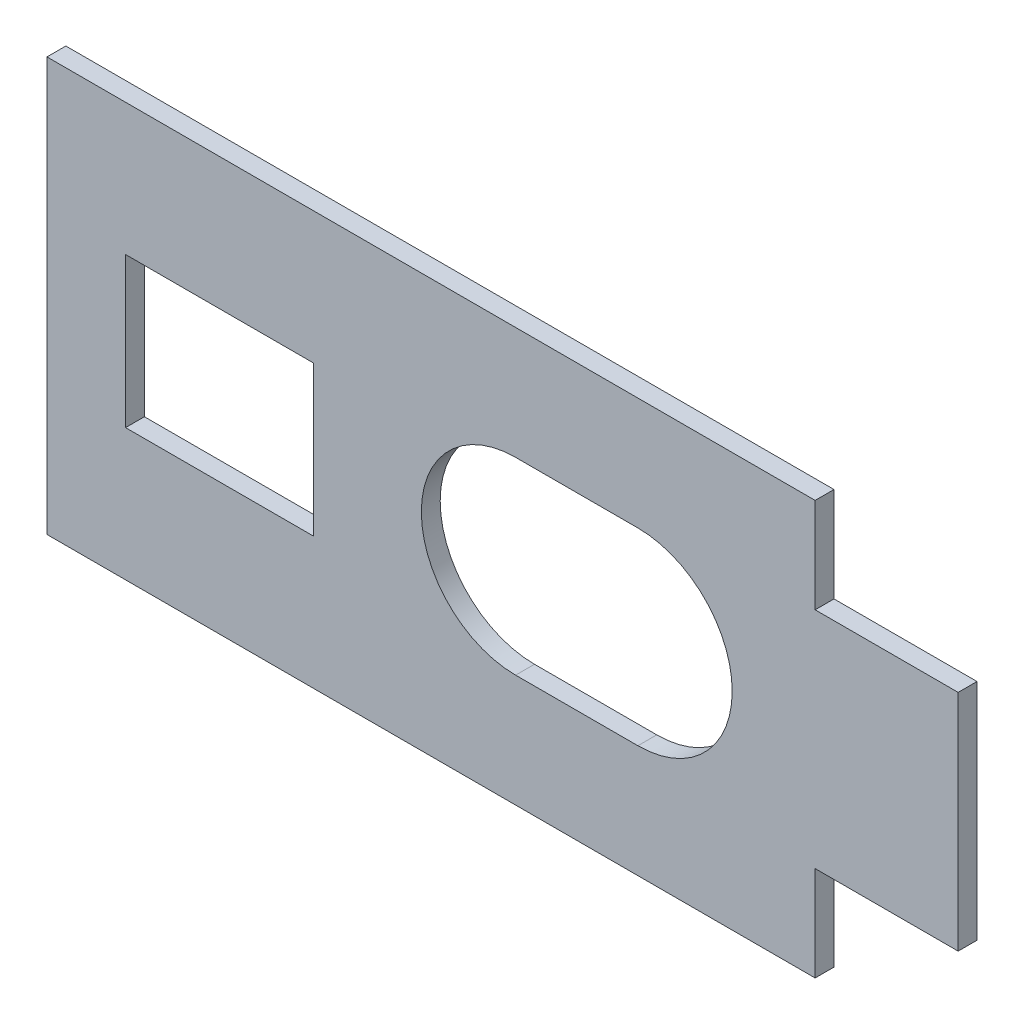
ISO-10303-21;
HEADER;
FILE_DESCRIPTION(('STEP AP214'),'2;1');
FILE_NAME('part.step','',(''),(''),'','','');
FILE_SCHEMA(('AUTOMOTIVE_DESIGN { 1 0 10303 214 1 1 1 1 }'));
ENDSEC;
DATA;
#1=APPLICATION_CONTEXT('core data for automotive mechanical design processes');
#2=APPLICATION_PROTOCOL_DEFINITION('international standard','automotive_design',2000,#1);
#3=PRODUCT_CONTEXT('',#1,'mechanical');
#4=PRODUCT('Part','Part','',(#3));
#5=PRODUCT_RELATED_PRODUCT_CATEGORY('part','',(#4));
#6=PRODUCT_DEFINITION_FORMATION('','',#4);
#7=PRODUCT_DEFINITION_CONTEXT('part definition',#1,'design');
#8=PRODUCT_DEFINITION('design','',#6,#7);
#9=PRODUCT_DEFINITION_SHAPE('','',#8);
#10=(LENGTH_UNIT() NAMED_UNIT(*) SI_UNIT(.MILLI.,.METRE.));
#11=(NAMED_UNIT(*) PLANE_ANGLE_UNIT() SI_UNIT($,.RADIAN.));
#12=(NAMED_UNIT(*) SI_UNIT($,.STERADIAN.) SOLID_ANGLE_UNIT());
#13=UNCERTAINTY_MEASURE_WITH_UNIT(LENGTH_MEASURE(1.E-05),#10,'distance_accuracy_value','');
#14=(GEOMETRIC_REPRESENTATION_CONTEXT(3) GLOBAL_UNCERTAINTY_ASSIGNED_CONTEXT((#13)) GLOBAL_UNIT_ASSIGNED_CONTEXT((#10,
#11,#12)) REPRESENTATION_CONTEXT('',''));
#15=CARTESIAN_POINT('',(0.,0.,0.));
#16=DIRECTION('',(0.,0.,1.));
#17=DIRECTION('',(1.,0.,0.));
#18=AXIS2_PLACEMENT_3D('',#15,#16,#17);
#19=CARTESIAN_POINT('',(0.,-19.1309,1.52399999999998));
#20=DIRECTION('',(0.,1.,0.));
#21=DIRECTION('',(0.,0.,1.));
#22=AXIS2_PLACEMENT_3D('',#19,#20,#21);
#23=PLANE('',#22);
#24=DIRECTION('',(1.,0.,0.));
#25=VECTOR('',#24,1.);
#26=CARTESIAN_POINT('',(0.,-19.1309,0.761999999999985));
#27=LINE('',#26,#25);
#28=CARTESIAN_POINT('',(-9.44244999999989,-19.1309,0.761999999999985));
#29=VERTEX_POINT('',#28);
#30=CARTESIAN_POINT('',(21.5952887724629,-19.1309,0.761999999999985));
#31=VERTEX_POINT('',#30);
#32=EDGE_CURVE('E209',#29,#31,#27,.T.);
#33=ORIENTED_EDGE('',*,*,#32,.F.);
#34=DIRECTION('',(0.,0.,-1.));
#35=VECTOR('',#34,1.);
#36=CARTESIAN_POINT('',(-9.44244999999989,-19.1309,1.52399999999998));
#37=LINE('',#36,#35);
#38=CARTESIAN_POINT('',(-9.44244999999989,-19.1309,1.52399999999998));
#39=VERTEX_POINT('',#38);
#40=EDGE_CURVE('E11',#39,#29,#37,.T.);
#41=ORIENTED_EDGE('',*,*,#40,.F.);
#42=DIRECTION('',(1.,0.,0.));
#43=VECTOR('',#42,1.);
#44=CARTESIAN_POINT('',(0.,-19.1309,1.52399999999998));
#45=LINE('',#44,#43);
#46=CARTESIAN_POINT('',(21.5952887724629,-19.1309,1.52399999999998));
#47=VERTEX_POINT('',#46);
#48=EDGE_CURVE('E289',#39,#47,#45,.T.);
#49=ORIENTED_EDGE('',*,*,#48,.T.);
#50=DIRECTION('',(0.,0.,-1.));
#51=VECTOR('',#50,1.);
#52=CARTESIAN_POINT('',(21.5952887724629,-19.1309,1.52399999999998));
#53=LINE('',#52,#51);
#54=EDGE_CURVE('E53',#47,#31,#53,.T.);
#55=ORIENTED_EDGE('',*,*,#54,.T.);
#56=EDGE_LOOP('',(#33,#41,#49,#55));
#57=FACE_BOUND('',#56,.T.);
#58=ADVANCED_FACE('F34',(#57),#23,.T.);
#59=CARTESIAN_POINT('',(-9.44244999999989,0.,1.52399999999998));
#60=DIRECTION('',(1.,0.,0.));
#61=DIRECTION('',(0.,0.,-1.));
#62=AXIS2_PLACEMENT_3D('',#59,#60,#61);
#63=PLANE('',#62);
#64=DIRECTION('',(0.,-1.,0.));
#65=VECTOR('',#64,1.);
#66=CARTESIAN_POINT('',(-9.44244999999989,0.,0.761999999999985));
#67=LINE('',#66,#65);
#68=CARTESIAN_POINT('',(-9.44244999999989,-35.8440999999999,0.761999999999985));
#69=VERTEX_POINT('',#68);
#70=EDGE_CURVE('E211',#29,#69,#67,.T.);
#71=ORIENTED_EDGE('',*,*,#70,.T.);
#72=DIRECTION('',(0.,0.,-1.));
#73=VECTOR('',#72,1.);
#74=CARTESIAN_POINT('',(-9.44244999999989,-35.8440999999999,1.52399999999998));
#75=LINE('',#74,#73);
#76=CARTESIAN_POINT('',(-9.44244999999989,-35.8440999999999,1.52399999999998));
#77=VERTEX_POINT('',#76);
#78=EDGE_CURVE('E44',#77,#69,#75,.T.);
#79=ORIENTED_EDGE('',*,*,#78,.F.);
#80=DIRECTION('',(0.,-1.,0.));
#81=VECTOR('',#80,1.);
#82=CARTESIAN_POINT('',(-9.44244999999989,0.,1.52399999999998));
#83=LINE('',#82,#81);
#84=EDGE_CURVE('E291',#39,#77,#83,.T.);
#85=ORIENTED_EDGE('',*,*,#84,.F.);
#86=ORIENTED_EDGE('',*,*,#40,.T.);
#87=EDGE_LOOP('',(#71,#79,#85,#86));
#88=FACE_BOUND('',#87,.T.);
#89=ADVANCED_FACE('F318',(#88),#63,.F.);
#90=CARTESIAN_POINT('',(0.,-35.8440999999999,1.52399999999998));
#91=DIRECTION('',(0.,1.,0.));
#92=DIRECTION('',(0.,0.,1.));
#93=AXIS2_PLACEMENT_3D('',#90,#91,#92);
#94=PLANE('',#93);
#95=DIRECTION('',(1.,0.,0.));
#96=VECTOR('',#95,1.);
#97=CARTESIAN_POINT('',(0.,-35.8440999999999,0.761999999999985));
#98=LINE('',#97,#96);
#99=CARTESIAN_POINT('',(21.5952887724629,-35.8440999999999,0.761999999999985));
#100=VERTEX_POINT('',#99);
#101=EDGE_CURVE('E214',#69,#100,#98,.T.);
#102=ORIENTED_EDGE('',*,*,#101,.T.);
#103=DIRECTION('',(0.,0.,-1.));
#104=VECTOR('',#103,1.);
#105=CARTESIAN_POINT('',(21.5952887724629,-35.8440999999999,1.52399999999998));
#106=LINE('',#105,#104);
#107=CARTESIAN_POINT('',(21.5952887724629,-35.8440999999999,1.52399999999998));
#108=VERTEX_POINT('',#107);
#109=EDGE_CURVE('E235',#108,#100,#106,.T.);
#110=ORIENTED_EDGE('',*,*,#109,.F.);
#111=DIRECTION('',(1.,0.,0.));
#112=VECTOR('',#111,1.);
#113=CARTESIAN_POINT('',(0.,-35.8440999999999,1.52399999999998));
#114=LINE('',#113,#112);
#115=EDGE_CURVE('E294',#77,#108,#114,.T.);
#116=ORIENTED_EDGE('',*,*,#115,.F.);
#117=ORIENTED_EDGE('',*,*,#78,.T.);
#118=EDGE_LOOP('',(#102,#110,#116,#117));
#119=FACE_BOUND('',#118,.T.);
#120=ADVANCED_FACE('F323',(#119),#94,.F.);
#121=CARTESIAN_POINT('',(21.5952887724628,0.,1.52399999999998));
#122=DIRECTION('',(1.,0.,0.));
#123=DIRECTION('',(0.,1.,0.));
#124=AXIS2_PLACEMENT_3D('',#121,#122,#123);
#125=PLANE('',#124);
#126=DIRECTION('',(0.,-1.,0.));
#127=VECTOR('',#126,1.);
#128=CARTESIAN_POINT('',(21.5952887724628,0.,0.761999999999985));
#129=LINE('',#128,#127);
#130=CARTESIAN_POINT('',(21.5952887724629,-32.01505,0.761999999999985));
#131=VERTEX_POINT('',#130);
#132=EDGE_CURVE('E217',#131,#100,#129,.T.);
#133=ORIENTED_EDGE('',*,*,#132,.F.);
#134=DIRECTION('',(0.,0.,-1.));
#135=VECTOR('',#134,1.);
#136=CARTESIAN_POINT('',(21.5952887724629,-32.01505,1.52399999999998));
#137=LINE('',#136,#135);
#138=CARTESIAN_POINT('',(21.5952887724629,-32.01505,1.52399999999998));
#139=VERTEX_POINT('',#138);
#140=EDGE_CURVE('E233',#139,#131,#137,.T.);
#141=ORIENTED_EDGE('',*,*,#140,.F.);
#142=DIRECTION('',(0.,-1.,0.));
#143=VECTOR('',#142,1.);
#144=CARTESIAN_POINT('',(21.5952887724628,0.,1.52399999999998));
#145=LINE('',#144,#143);
#146=EDGE_CURVE('E180',#139,#108,#145,.T.);
#147=ORIENTED_EDGE('',*,*,#146,.T.);
#148=ORIENTED_EDGE('',*,*,#109,.T.);
#149=EDGE_LOOP('',(#133,#141,#147,#148));
#150=FACE_BOUND('',#149,.T.);
#151=ADVANCED_FACE('F298',(#150),#125,.T.);
#152=CARTESIAN_POINT('',(0.,-32.01505,1.52399999999998));
#153=DIRECTION('',(0.,-1.,0.));
#154=DIRECTION('',(0.,0.,-1.));
#155=AXIS2_PLACEMENT_3D('',#152,#153,#154);
#156=PLANE('',#155);
#157=DIRECTION('',(-1.,0.,0.));
#158=VECTOR('',#157,1.);
#159=CARTESIAN_POINT('',(0.,-32.01505,0.761999999999985));
#160=LINE('',#159,#158);
#161=CARTESIAN_POINT('',(27.3737887724629,-32.01505,0.761999999999985));
#162=VERTEX_POINT('',#161);
#163=EDGE_CURVE('E220',#162,#131,#160,.T.);
#164=ORIENTED_EDGE('',*,*,#163,.F.);
#165=DIRECTION('',(0.,0.,-1.));
#166=VECTOR('',#165,1.);
#167=CARTESIAN_POINT('',(27.3737887724629,-32.01505,1.52399999999998));
#168=LINE('',#167,#166);
#169=CARTESIAN_POINT('',(27.3737887724629,-32.01505,1.52399999999998));
#170=VERTEX_POINT('',#169);
#171=EDGE_CURVE('E165',#170,#162,#168,.T.);
#172=ORIENTED_EDGE('',*,*,#171,.F.);
#173=DIRECTION('',(-1.,0.,0.));
#174=VECTOR('',#173,1.);
#175=CARTESIAN_POINT('',(0.,-32.01505,1.52399999999998));
#176=LINE('',#175,#174);
#177=EDGE_CURVE('E178',#170,#139,#176,.T.);
#178=ORIENTED_EDGE('',*,*,#177,.T.);
#179=ORIENTED_EDGE('',*,*,#140,.T.);
#180=EDGE_LOOP('',(#164,#172,#178,#179));
#181=FACE_BOUND('',#180,.T.);
#182=ADVANCED_FACE('F302',(#181),#156,.T.);
#183=CARTESIAN_POINT('',(27.3737887724629,0.,1.52399999999998));
#184=DIRECTION('',(1.,0.,0.));
#185=DIRECTION('',(0.,0.,-1.));
#186=AXIS2_PLACEMENT_3D('',#183,#184,#185);
#187=PLANE('',#186);
#188=DIRECTION('',(0.,-1.,0.));
#189=VECTOR('',#188,1.);
#190=CARTESIAN_POINT('',(27.3737887724629,0.,0.761999999999985));
#191=LINE('',#190,#189);
#192=CARTESIAN_POINT('',(27.3737887724629,-22.95995,0.761999999999985));
#193=VERTEX_POINT('',#192);
#194=EDGE_CURVE('E162',#193,#162,#191,.T.);
#195=ORIENTED_EDGE('',*,*,#194,.F.);
#196=DIRECTION('',(0.,0.,-1.));
#197=VECTOR('',#196,1.);
#198=CARTESIAN_POINT('',(27.3737887724629,-22.95995,1.52399999999998));
#199=LINE('',#198,#197);
#200=CARTESIAN_POINT('',(27.3737887724629,-22.95995,1.52399999999998));
#201=VERTEX_POINT('',#200);
#202=EDGE_CURVE('E156',#201,#193,#199,.T.);
#203=ORIENTED_EDGE('',*,*,#202,.F.);
#204=DIRECTION('',(0.,-1.,0.));
#205=VECTOR('',#204,1.);
#206=CARTESIAN_POINT('',(27.3737887724629,0.,1.52399999999998));
#207=LINE('',#206,#205);
#208=EDGE_CURVE('E160',#201,#170,#207,.T.);
#209=ORIENTED_EDGE('',*,*,#208,.T.);
#210=ORIENTED_EDGE('',*,*,#171,.T.);
#211=EDGE_LOOP('',(#195,#203,#209,#210));
#212=FACE_BOUND('',#211,.T.);
#213=ADVANCED_FACE('F158',(#212),#187,.T.);
#214=CARTESIAN_POINT('',(0.,-22.95995,1.52399999999998));
#215=DIRECTION('',(0.,-1.,0.));
#216=DIRECTION('',(0.,0.,-1.));
#217=AXIS2_PLACEMENT_3D('',#214,#215,#216);
#218=PLANE('',#217);
#219=DIRECTION('',(-1.,0.,0.));
#220=VECTOR('',#219,1.);
#221=CARTESIAN_POINT('',(0.,-22.95995,0.761999999999985));
#222=LINE('',#221,#220);
#223=CARTESIAN_POINT('',(21.5952887724629,-22.95995,0.761999999999985));
#224=VERTEX_POINT('',#223);
#225=EDGE_CURVE('E224',#193,#224,#222,.T.);
#226=ORIENTED_EDGE('',*,*,#225,.T.);
#227=DIRECTION('',(0.,0.,-1.));
#228=VECTOR('',#227,1.);
#229=CARTESIAN_POINT('',(21.5952887724629,-22.95995,1.52399999999998));
#230=LINE('',#229,#228);
#231=CARTESIAN_POINT('',(21.5952887724629,-22.95995,1.52399999999998));
#232=VERTEX_POINT('',#231);
#233=EDGE_CURVE('E103',#232,#224,#230,.T.);
#234=ORIENTED_EDGE('',*,*,#233,.F.);
#235=DIRECTION('',(-1.,0.,0.));
#236=VECTOR('',#235,1.);
#237=CARTESIAN_POINT('',(0.,-22.95995,1.52399999999998));
#238=LINE('',#237,#236);
#239=EDGE_CURVE('E167',#201,#232,#238,.T.);
#240=ORIENTED_EDGE('',*,*,#239,.F.);
#241=ORIENTED_EDGE('',*,*,#202,.T.);
#242=EDGE_LOOP('',(#226,#234,#240,#241));
#243=FACE_BOUND('',#242,.T.);
#244=ADVANCED_FACE('F168',(#243),#218,.F.);
#245=CARTESIAN_POINT('',(14.4335500000001,-27.4875,1.52399999999998));
#246=DIRECTION('',(0.,0.,-1.));
#247=DIRECTION('',(-1.,0.,0.));
#248=AXIS2_PLACEMENT_3D('',#245,#246,#247);
#249=CYLINDRICAL_SURFACE('',#248,3.81);
#250=CARTESIAN_POINT('',(14.4335500000001,-27.4875,0.761999999999985));
#251=DIRECTION('',(0.,0.,1.));
#252=DIRECTION('',(1.,0.,0.));
#253=AXIS2_PLACEMENT_3D('',#250,#251,#252);
#254=CIRCLE('',#253,3.81);
#255=CARTESIAN_POINT('',(14.4335500000001,-31.2975,0.761999999999985));
#256=VERTEX_POINT('',#255);
#257=CARTESIAN_POINT('',(14.4335500000001,-23.6775,0.761999999999985));
#258=VERTEX_POINT('',#257);
#259=EDGE_CURVE('E197',#256,#258,#254,.T.);
#260=ORIENTED_EDGE('',*,*,#259,.F.);
#261=DIRECTION('',(0.,0.,-1.));
#262=VECTOR('',#261,1.);
#263=CARTESIAN_POINT('',(14.4335500000001,-31.2975,1.52399999999998));
#264=LINE('',#263,#262);
#265=CARTESIAN_POINT('',(14.4335500000001,-31.2975,1.52399999999998));
#266=VERTEX_POINT('',#265);
#267=EDGE_CURVE('E230',#266,#256,#264,.T.);
#268=ORIENTED_EDGE('',*,*,#267,.F.);
#269=CARTESIAN_POINT('',(14.4335500000001,-27.4875,1.52399999999998));
#270=DIRECTION('',(0.,0.,1.));
#271=DIRECTION('',(1.,0.,0.));
#272=AXIS2_PLACEMENT_3D('',#269,#270,#271);
#273=CIRCLE('',#272,3.81);
#274=CARTESIAN_POINT('',(14.4335500000001,-23.6775,1.52399999999998));
#275=VERTEX_POINT('',#274);
#276=EDGE_CURVE('E272',#266,#275,#273,.T.);
#277=ORIENTED_EDGE('',*,*,#276,.T.);
#278=DIRECTION('',(0.,0.,-1.));
#279=VECTOR('',#278,1.);
#280=CARTESIAN_POINT('',(14.4335500000001,-23.6775,1.52399999999998));
#281=LINE('',#280,#279);
#282=EDGE_CURVE('E239',#275,#258,#281,.T.);
#283=ORIENTED_EDGE('',*,*,#282,.T.);
#284=EDGE_LOOP('',(#260,#268,#277,#283));
#285=FACE_BOUND('',#284,.T.);
#286=ADVANCED_FACE('F338',(#285),#249,.F.);
#287=CARTESIAN_POINT('',(0.,-31.2975,1.52399999999998));
#288=DIRECTION('',(0.,-1.,0.));
#289=DIRECTION('',(0.,0.,-1.));
#290=AXIS2_PLACEMENT_3D('',#287,#288,#289);
#291=PLANE('',#290);
#292=DIRECTION('',(-1.,0.,0.));
#293=VECTOR('',#292,1.);
#294=CARTESIAN_POINT('',(0.,-31.2975,0.761999999999985));
#295=LINE('',#294,#293);
#296=CARTESIAN_POINT('',(9.4932500000001,-31.2975,0.761999999999985));
#297=VERTEX_POINT('',#296);
#298=EDGE_CURVE('E200',#256,#297,#295,.T.);
#299=ORIENTED_EDGE('',*,*,#298,.T.);
#300=DIRECTION('',(0.,0.,-1.));
#301=VECTOR('',#300,1.);
#302=CARTESIAN_POINT('',(9.4932500000001,-31.2975,1.52399999999998));
#303=LINE('',#302,#301);
#304=CARTESIAN_POINT('',(9.4932500000001,-31.2975,1.52399999999998));
#305=VERTEX_POINT('',#304);
#306=EDGE_CURVE('E243',#305,#297,#303,.T.);
#307=ORIENTED_EDGE('',*,*,#306,.F.);
#308=DIRECTION('',(-1.,0.,0.));
#309=VECTOR('',#308,1.);
#310=CARTESIAN_POINT('',(0.,-31.2975,1.52399999999998));
#311=LINE('',#310,#309);
#312=EDGE_CURVE('E281',#266,#305,#311,.T.);
#313=ORIENTED_EDGE('',*,*,#312,.F.);
#314=ORIENTED_EDGE('',*,*,#267,.T.);
#315=EDGE_LOOP('',(#299,#307,#313,#314));
#316=FACE_BOUND('',#315,.T.);
#317=ADVANCED_FACE('F334',(#316),#291,.F.);
#318=CARTESIAN_POINT('',(9.4932500000001,-27.4875,1.52399999999998));
#319=DIRECTION('',(0.,0.,-1.));
#320=DIRECTION('',(-1.,0.,0.));
#321=AXIS2_PLACEMENT_3D('',#318,#319,#320);
#322=CYLINDRICAL_SURFACE('',#321,3.81);
#323=CARTESIAN_POINT('',(9.4932500000001,-27.4875,0.761999999999985));
#324=DIRECTION('',(0.,0.,1.));
#325=DIRECTION('',(1.,0.,0.));
#326=AXIS2_PLACEMENT_3D('',#323,#324,#325);
#327=CIRCLE('',#326,3.81);
#328=CARTESIAN_POINT('',(9.4932500000001,-23.6775,0.761999999999985));
#329=VERTEX_POINT('',#328);
#330=EDGE_CURVE('E203',#329,#297,#327,.T.);
#331=ORIENTED_EDGE('',*,*,#330,.F.);
#332=DIRECTION('',(0.,0.,-1.));
#333=VECTOR('',#332,1.);
#334=CARTESIAN_POINT('',(9.4932500000001,-23.6775,1.52399999999998));
#335=LINE('',#334,#333);
#336=CARTESIAN_POINT('',(9.4932500000001,-23.6775,1.52399999999998));
#337=VERTEX_POINT('',#336);
#338=EDGE_CURVE('E241',#337,#329,#335,.T.);
#339=ORIENTED_EDGE('',*,*,#338,.F.);
#340=CARTESIAN_POINT('',(9.4932500000001,-27.4875,1.52399999999998));
#341=DIRECTION('',(0.,0.,1.));
#342=DIRECTION('',(1.,0.,0.));
#343=AXIS2_PLACEMENT_3D('',#340,#341,#342);
#344=CIRCLE('',#343,3.81);
#345=EDGE_CURVE('E283',#337,#305,#344,.T.);
#346=ORIENTED_EDGE('',*,*,#345,.T.);
#347=ORIENTED_EDGE('',*,*,#306,.T.);
#348=EDGE_LOOP('',(#331,#339,#346,#347));
#349=FACE_BOUND('',#348,.T.);
#350=ADVANCED_FACE('F331',(#349),#322,.F.);
#351=CARTESIAN_POINT('',(1.3271500000001,0.,1.52399999999998));
#352=DIRECTION('',(1.,0.,0.));
#353=DIRECTION('',(0.,0.,-1.));
#354=AXIS2_PLACEMENT_3D('',#351,#352,#353);
#355=PLANE('',#354);
#356=DIRECTION('',(0.,-1.,0.));
#357=VECTOR('',#356,1.);
#358=CARTESIAN_POINT('',(1.3271500000001,0.,0.761999999999985));
#359=LINE('',#358,#357);
#360=CARTESIAN_POINT('',(1.3271500000001,-24.45855,0.761999999999985));
#361=VERTEX_POINT('',#360);
#362=CARTESIAN_POINT('',(1.3271500000001,-30.51645,0.761999999999985));
#363=VERTEX_POINT('',#362);
#364=EDGE_CURVE('E186',#361,#363,#359,.T.);
#365=ORIENTED_EDGE('',*,*,#364,.T.);
#366=DIRECTION('',(0.,0.,-1.));
#367=VECTOR('',#366,1.);
#368=CARTESIAN_POINT('',(1.3271500000001,-30.51645,1.52399999999998));
#369=LINE('',#368,#367);
#370=CARTESIAN_POINT('',(1.3271500000001,-30.51645,1.52399999999998));
#371=VERTEX_POINT('',#370);
#372=EDGE_CURVE('E38',#371,#363,#369,.T.);
#373=ORIENTED_EDGE('',*,*,#372,.F.);
#374=DIRECTION('',(0.,-1.,0.));
#375=VECTOR('',#374,1.);
#376=CARTESIAN_POINT('',(1.3271500000001,0.,1.52399999999998));
#377=LINE('',#376,#375);
#378=CARTESIAN_POINT('',(1.3271500000001,-24.45855,1.52399999999998));
#379=VERTEX_POINT('',#378);
#380=EDGE_CURVE('E116',#379,#371,#377,.T.);
#381=ORIENTED_EDGE('',*,*,#380,.F.);
#382=DIRECTION('',(0.,0.,-1.));
#383=VECTOR('',#382,1.);
#384=CARTESIAN_POINT('',(1.3271500000001,-24.45855,1.52399999999998));
#385=LINE('',#384,#383);
#386=EDGE_CURVE('E185',#379,#361,#385,.T.);
#387=ORIENTED_EDGE('',*,*,#386,.T.);
#388=EDGE_LOOP('',(#365,#373,#381,#387));
#389=FACE_BOUND('',#388,.T.);
#390=ADVANCED_FACE('F36',(#389),#355,.F.);
#391=CARTESIAN_POINT('',(0.,-30.51645,1.52399999999998));
#392=DIRECTION('',(0.,1.,0.));
#393=DIRECTION('',(0.,0.,1.));
#394=AXIS2_PLACEMENT_3D('',#391,#392,#393);
#395=PLANE('',#394);
#396=DIRECTION('',(1.,0.,0.));
#397=VECTOR('',#396,1.);
#398=CARTESIAN_POINT('',(0.,-30.51645,0.761999999999985));
#399=LINE('',#398,#397);
#400=CARTESIAN_POINT('',(-6.2674499999999,-30.51645,0.761999999999985));
#401=VERTEX_POINT('',#400);
#402=EDGE_CURVE('E189',#401,#363,#399,.T.);
#403=ORIENTED_EDGE('',*,*,#402,.F.);
#404=DIRECTION('',(0.,0.,-1.));
#405=VECTOR('',#404,1.);
#406=CARTESIAN_POINT('',(-6.2674499999999,-30.51645,1.52399999999998));
#407=LINE('',#406,#405);
#408=CARTESIAN_POINT('',(-6.2674499999999,-30.51645,1.52399999999998));
#409=VERTEX_POINT('',#408);
#410=EDGE_CURVE('E249',#409,#401,#407,.T.);
#411=ORIENTED_EDGE('',*,*,#410,.F.);
#412=DIRECTION('',(1.,0.,0.));
#413=VECTOR('',#412,1.);
#414=CARTESIAN_POINT('',(0.,-30.51645,1.52399999999998));
#415=LINE('',#414,#413);
#416=EDGE_CURVE('E257',#409,#371,#415,.T.);
#417=ORIENTED_EDGE('',*,*,#416,.T.);
#418=ORIENTED_EDGE('',*,*,#372,.T.);
#419=EDGE_LOOP('',(#403,#411,#417,#418));
#420=FACE_BOUND('',#419,.T.);
#421=ADVANCED_FACE('F256',(#420),#395,.T.);
#422=CARTESIAN_POINT('',(-6.2674499999999,0.,1.52399999999998));
#423=DIRECTION('',(1.,0.,0.));
#424=DIRECTION('',(0.,0.,-1.));
#425=AXIS2_PLACEMENT_3D('',#422,#423,#424);
#426=PLANE('',#425);
#427=DIRECTION('',(0.,-1.,0.));
#428=VECTOR('',#427,1.);
#429=CARTESIAN_POINT('',(-6.2674499999999,0.,0.761999999999985));
#430=LINE('',#429,#428);
#431=CARTESIAN_POINT('',(-6.2674499999999,-24.45855,0.761999999999985));
#432=VERTEX_POINT('',#431);
#433=EDGE_CURVE('E192',#432,#401,#430,.T.);
#434=ORIENTED_EDGE('',*,*,#433,.F.);
#435=DIRECTION('',(0.,0.,-1.));
#436=VECTOR('',#435,1.);
#437=CARTESIAN_POINT('',(-6.2674499999999,-24.45855,1.52399999999998));
#438=LINE('',#437,#436);
#439=CARTESIAN_POINT('',(-6.2674499999999,-24.45855,1.52399999999998));
#440=VERTEX_POINT('',#439);
#441=EDGE_CURVE('E248',#440,#432,#438,.T.);
#442=ORIENTED_EDGE('',*,*,#441,.F.);
#443=DIRECTION('',(0.,-1.,0.));
#444=VECTOR('',#443,1.);
#445=CARTESIAN_POINT('',(-6.2674499999999,0.,1.52399999999998));
#446=LINE('',#445,#444);
#447=EDGE_CURVE('E268',#440,#409,#446,.T.);
#448=ORIENTED_EDGE('',*,*,#447,.T.);
#449=ORIENTED_EDGE('',*,*,#410,.T.);
#450=EDGE_LOOP('',(#434,#442,#448,#449));
#451=FACE_BOUND('',#450,.T.);
#452=ADVANCED_FACE('F265',(#451),#426,.T.);
#453=CARTESIAN_POINT('',(0.,-23.6775,1.52399999999998));
#454=DIRECTION('',(0.,-1.,0.));
#455=DIRECTION('',(0.,0.,-1.));
#456=AXIS2_PLACEMENT_3D('',#453,#454,#455);
#457=PLANE('',#456);
#458=DIRECTION('',(-1.,0.,0.));
#459=VECTOR('',#458,1.);
#460=CARTESIAN_POINT('',(0.,-23.6775,0.761999999999985));
#461=LINE('',#460,#459);
#462=EDGE_CURVE('E206',#258,#329,#461,.T.);
#463=ORIENTED_EDGE('',*,*,#462,.F.);
#464=ORIENTED_EDGE('',*,*,#282,.F.);
#465=DIRECTION('',(-1.,0.,0.));
#466=VECTOR('',#465,1.);
#467=CARTESIAN_POINT('',(0.,-23.6775,1.52399999999998));
#468=LINE('',#467,#466);
#469=EDGE_CURVE('E286',#275,#337,#468,.T.);
#470=ORIENTED_EDGE('',*,*,#469,.T.);
#471=ORIENTED_EDGE('',*,*,#338,.T.);
#472=EDGE_LOOP('',(#463,#464,#470,#471));
#473=FACE_BOUND('',#472,.T.);
#474=ADVANCED_FACE('F313',(#473),#457,.T.);
#475=CARTESIAN_POINT('',(0.,-24.45855,1.52399999999998));
#476=DIRECTION('',(0.,1.,0.));
#477=DIRECTION('',(0.,0.,1.));
#478=AXIS2_PLACEMENT_3D('',#475,#476,#477);
#479=PLANE('',#478);
#480=DIRECTION('',(1.,0.,0.));
#481=VECTOR('',#480,1.);
#482=CARTESIAN_POINT('',(0.,-24.45855,0.761999999999985));
#483=LINE('',#482,#481);
#484=EDGE_CURVE('E195',#432,#361,#483,.T.);
#485=ORIENTED_EDGE('',*,*,#484,.T.);
#486=ORIENTED_EDGE('',*,*,#386,.F.);
#487=DIRECTION('',(1.,0.,0.));
#488=VECTOR('',#487,1.);
#489=CARTESIAN_POINT('',(0.,-24.45855,1.52399999999998));
#490=LINE('',#489,#488);
#491=EDGE_CURVE('E270',#440,#379,#490,.T.);
#492=ORIENTED_EDGE('',*,*,#491,.F.);
#493=ORIENTED_EDGE('',*,*,#441,.T.);
#494=EDGE_LOOP('',(#485,#486,#492,#493));
#495=FACE_BOUND('',#494,.T.);
#496=ADVANCED_FACE('F271',(#495),#479,.F.);
#497=CARTESIAN_POINT('',(21.5952887724629,0.,1.52399999999998));
#498=DIRECTION('',(1.,0.,0.));
#499=DIRECTION('',(0.,1.,0.));
#500=AXIS2_PLACEMENT_3D('',#497,#498,#499);
#501=PLANE('',#500);
#502=DIRECTION('',(0.,-1.,0.));
#503=VECTOR('',#502,1.);
#504=CARTESIAN_POINT('',(21.5952887724629,0.,0.761999999999985));
#505=LINE('',#504,#503);
#506=EDGE_CURVE('E226',#31,#224,#505,.T.);
#507=ORIENTED_EDGE('',*,*,#506,.F.);
#508=ORIENTED_EDGE('',*,*,#54,.F.);
#509=DIRECTION('',(0.,-1.,0.));
#510=VECTOR('',#509,1.);
#511=CARTESIAN_POINT('',(21.5952887724629,0.,1.52399999999998));
#512=LINE('',#511,#510);
#513=EDGE_CURVE('E171',#47,#232,#512,.T.);
#514=ORIENTED_EDGE('',*,*,#513,.T.);
#515=ORIENTED_EDGE('',*,*,#233,.T.);
#516=EDGE_LOOP('',(#507,#508,#514,#515));
#517=FACE_BOUND('',#516,.T.);
#518=ADVANCED_FACE('F305',(#517),#501,.T.);
#519=CARTESIAN_POINT('',(0.,0.,1.52399999999998));
#520=DIRECTION('',(0.,0.,1.));
#521=DIRECTION('',(1.,0.,0.));
#522=AXIS2_PLACEMENT_3D('',#519,#520,#521);
#523=PLANE('',#522);
#524=ORIENTED_EDGE('',*,*,#380,.T.);
#525=ORIENTED_EDGE('',*,*,#416,.F.);
#526=ORIENTED_EDGE('',*,*,#447,.F.);
#527=ORIENTED_EDGE('',*,*,#491,.T.);
#528=EDGE_LOOP('',(#524,#525,#526,#527));
#529=FACE_BOUND('',#528,.T.);
#530=ORIENTED_EDGE('',*,*,#276,.F.);
#531=ORIENTED_EDGE('',*,*,#312,.T.);
#532=ORIENTED_EDGE('',*,*,#345,.F.);
#533=ORIENTED_EDGE('',*,*,#469,.F.);
#534=EDGE_LOOP('',(#530,#531,#532,#533));
#535=FACE_BOUND('',#534,.T.);
#536=ORIENTED_EDGE('',*,*,#48,.F.);
#537=ORIENTED_EDGE('',*,*,#84,.T.);
#538=ORIENTED_EDGE('',*,*,#115,.T.);
#539=ORIENTED_EDGE('',*,*,#146,.F.);
#540=ORIENTED_EDGE('',*,*,#177,.F.);
#541=ORIENTED_EDGE('',*,*,#208,.F.);
#542=ORIENTED_EDGE('',*,*,#239,.T.);
#543=ORIENTED_EDGE('',*,*,#513,.F.);
#544=EDGE_LOOP('',(#536,#537,#538,#539,#540,#541,#542,#543));
#545=FACE_BOUND('',#544,.T.);
#546=ADVANCED_FACE('F175',(#529,#535,#545),#523,.T.);
#547=CARTESIAN_POINT('',(0.,0.,0.761999999999985));
#548=DIRECTION('',(0.,0.,1.));
#549=DIRECTION('',(1.,0.,0.));
#550=AXIS2_PLACEMENT_3D('',#547,#548,#549);
#551=PLANE('',#550);
#552=ORIENTED_EDGE('',*,*,#364,.F.);
#553=ORIENTED_EDGE('',*,*,#484,.F.);
#554=ORIENTED_EDGE('',*,*,#433,.T.);
#555=ORIENTED_EDGE('',*,*,#402,.T.);
#556=EDGE_LOOP('',(#552,#553,#554,#555));
#557=FACE_BOUND('',#556,.T.);
#558=ORIENTED_EDGE('',*,*,#259,.T.);
#559=ORIENTED_EDGE('',*,*,#462,.T.);
#560=ORIENTED_EDGE('',*,*,#330,.T.);
#561=ORIENTED_EDGE('',*,*,#298,.F.);
#562=EDGE_LOOP('',(#558,#559,#560,#561));
#563=FACE_BOUND('',#562,.T.);
#564=ORIENTED_EDGE('',*,*,#32,.T.);
#565=ORIENTED_EDGE('',*,*,#506,.T.);
#566=ORIENTED_EDGE('',*,*,#225,.F.);
#567=ORIENTED_EDGE('',*,*,#194,.T.);
#568=ORIENTED_EDGE('',*,*,#163,.T.);
#569=ORIENTED_EDGE('',*,*,#132,.T.);
#570=ORIENTED_EDGE('',*,*,#101,.F.);
#571=ORIENTED_EDGE('',*,*,#70,.F.);
#572=EDGE_LOOP('',(#564,#565,#566,#567,#568,#569,#570,#571));
#573=FACE_BOUND('',#572,.T.);
#574=ADVANCED_FACE('F263',(#557,#563,#573),#551,.F.);
#575=CLOSED_SHELL('',(#58,#89,#120,#151,#182,#213,#244,#286,#317,#350,#390,#421,#452,#474,#496,
#518,#546,#574));
#576=MANIFOLD_SOLID_BREP('B2',#575);
#577=ADVANCED_BREP_SHAPE_REPRESENTATION('',(#18,#576),#14);
#578=SHAPE_DEFINITION_REPRESENTATION(#9,#577);
ENDSEC;
END-ISO-10303-21;
